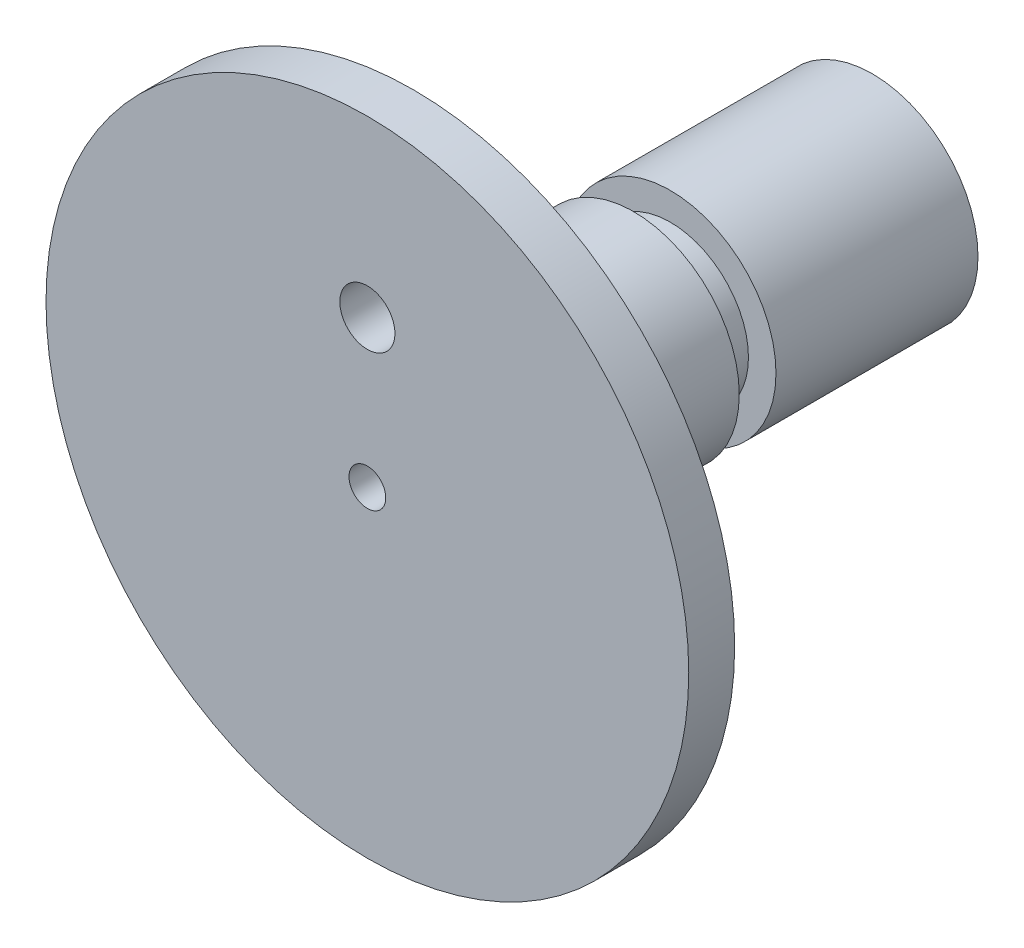
ISO-10303-21;
HEADER;
FILE_DESCRIPTION(('STEP AP214'),'2;1');
FILE_NAME('part.step','',(''),(''),'','','');
FILE_SCHEMA(('AUTOMOTIVE_DESIGN { 1 0 10303 214 1 1 1 1 }'));
ENDSEC;
DATA;
#1=APPLICATION_CONTEXT('core data for automotive mechanical design processes');
#2=APPLICATION_PROTOCOL_DEFINITION('international standard','automotive_design',2000,#1);
#3=PRODUCT_CONTEXT('',#1,'mechanical');
#4=PRODUCT('Part','Part','',(#3));
#5=PRODUCT_RELATED_PRODUCT_CATEGORY('part','',(#4));
#6=PRODUCT_DEFINITION_FORMATION('','',#4);
#7=PRODUCT_DEFINITION_CONTEXT('part definition',#1,'design');
#8=PRODUCT_DEFINITION('design','',#6,#7);
#9=PRODUCT_DEFINITION_SHAPE('','',#8);
#10=(LENGTH_UNIT() NAMED_UNIT(*) SI_UNIT(.MILLI.,.METRE.));
#11=(NAMED_UNIT(*) PLANE_ANGLE_UNIT() SI_UNIT($,.RADIAN.));
#12=(NAMED_UNIT(*) SI_UNIT($,.STERADIAN.) SOLID_ANGLE_UNIT());
#13=UNCERTAINTY_MEASURE_WITH_UNIT(LENGTH_MEASURE(1.E-05),#10,'distance_accuracy_value','');
#14=(GEOMETRIC_REPRESENTATION_CONTEXT(3) GLOBAL_UNCERTAINTY_ASSIGNED_CONTEXT((#13)) GLOBAL_UNIT_ASSIGNED_CONTEXT((#10,
#11,#12)) REPRESENTATION_CONTEXT('',''));
#15=CARTESIAN_POINT('',(0.,0.,0.));
#16=DIRECTION('',(0.,0.,1.));
#17=DIRECTION('',(1.,0.,0.));
#18=AXIS2_PLACEMENT_3D('',#15,#16,#17);
#19=CARTESIAN_POINT('',(0.,0.,-26.25));
#20=DIRECTION('',(0.,0.,1.));
#21=DIRECTION('',(1.,0.,0.));
#22=AXIS2_PLACEMENT_3D('',#19,#20,#21);
#23=CYLINDRICAL_SURFACE('',#22,5.75);
#24=CARTESIAN_POINT('',(0.,0.,-7.25));
#25=DIRECTION('',(0.,0.,1.));
#26=DIRECTION('',(1.,0.,0.));
#27=AXIS2_PLACEMENT_3D('',#24,#25,#26);
#28=CIRCLE('',#27,5.75);
#29=CARTESIAN_POINT('',(5.75,0.,-7.25));
#30=VERTEX_POINT('',#29);
#31=EDGE_CURVE('E161',#30,#30,#28,.T.);
#32=ORIENTED_EDGE('',*,*,#31,.T.);
#33=EDGE_LOOP('',(#32));
#34=FACE_BOUND('',#33,.T.);
#35=CARTESIAN_POINT('',(0.,0.,-1.25));
#36=DIRECTION('',(0.,0.,-1.));
#37=DIRECTION('',(-1.,0.,0.));
#38=AXIS2_PLACEMENT_3D('',#35,#36,#37);
#39=CIRCLE('',#38,5.75);
#40=CARTESIAN_POINT('',(-5.75,0.,-1.25));
#41=VERTEX_POINT('',#40);
#42=EDGE_CURVE('E11',#41,#41,#39,.T.);
#43=ORIENTED_EDGE('',*,*,#42,.T.);
#44=EDGE_LOOP('',(#43));
#45=FACE_BOUND('',#44,.T.);
#46=ADVANCED_FACE('F40',(#34,#45),#23,.T.);
#47=CARTESIAN_POINT('',(0.,0.,1.25));
#48=DIRECTION('',(0.,0.,-1.));
#49=DIRECTION('',(-1.,0.,0.));
#50=AXIS2_PLACEMENT_3D('',#47,#48,#49);
#51=CYLINDRICAL_SURFACE('',#50,17.5);
#52=CARTESIAN_POINT('',(0.,0.,1.25));
#53=DIRECTION('',(0.,0.,1.));
#54=DIRECTION('',(1.,0.,0.));
#55=AXIS2_PLACEMENT_3D('',#52,#53,#54);
#56=CIRCLE('',#55,17.5);
#57=CARTESIAN_POINT('',(17.5,0.,1.25));
#58=VERTEX_POINT('',#57);
#59=EDGE_CURVE('E50',#58,#58,#56,.T.);
#60=ORIENTED_EDGE('',*,*,#59,.F.);
#61=EDGE_LOOP('',(#60));
#62=FACE_BOUND('',#61,.T.);
#63=CARTESIAN_POINT('',(0.,0.,-1.25));
#64=DIRECTION('',(0.,0.,1.));
#65=DIRECTION('',(1.,0.,0.));
#66=AXIS2_PLACEMENT_3D('',#63,#64,#65);
#67=CIRCLE('',#66,17.5);
#68=CARTESIAN_POINT('',(17.5,0.,-1.25));
#69=VERTEX_POINT('',#68);
#70=EDGE_CURVE('E92',#69,#69,#67,.T.);
#71=ORIENTED_EDGE('',*,*,#70,.T.);
#72=EDGE_LOOP('',(#71));
#73=FACE_BOUND('',#72,.T.);
#74=ADVANCED_FACE('F42',(#62,#73),#51,.T.);
#75=CARTESIAN_POINT('',(0.,0.,1.25));
#76=DIRECTION('',(0.,0.,1.));
#77=DIRECTION('',(1.,0.,0.));
#78=AXIS2_PLACEMENT_3D('',#75,#76,#77);
#79=PLANE('',#78);
#80=CARTESIAN_POINT('',(0.,8.,1.25));
#81=DIRECTION('',(0.,0.,1.));
#82=DIRECTION('',(1.,0.,0.));
#83=AXIS2_PLACEMENT_3D('',#80,#81,#82);
#84=CIRCLE('',#83,1.5);
#85=CARTESIAN_POINT('',(1.5,8.,1.25));
#86=VERTEX_POINT('',#85);
#87=EDGE_CURVE('E155',#86,#86,#84,.T.);
#88=ORIENTED_EDGE('',*,*,#87,.F.);
#89=EDGE_LOOP('',(#88));
#90=FACE_BOUND('',#89,.T.);
#91=CARTESIAN_POINT('',(0.,0.,1.25));
#92=DIRECTION('',(0.,0.,1.));
#93=DIRECTION('',(1.,0.,0.));
#94=AXIS2_PLACEMENT_3D('',#91,#92,#93);
#95=CIRCLE('',#94,1.);
#96=CARTESIAN_POINT('',(1.,0.,1.25));
#97=VERTEX_POINT('',#96);
#98=EDGE_CURVE('E146',#97,#97,#95,.T.);
#99=ORIENTED_EDGE('',*,*,#98,.F.);
#100=EDGE_LOOP('',(#99));
#101=FACE_BOUND('',#100,.T.);
#102=ORIENTED_EDGE('',*,*,#59,.T.);
#103=EDGE_LOOP('',(#102));
#104=FACE_BOUND('',#103,.T.);
#105=ADVANCED_FACE('F218',(#90,#101,#104),#79,.T.);
#106=CARTESIAN_POINT('',(0.,0.,-1.25));
#107=DIRECTION('',(0.,0.,1.));
#108=DIRECTION('',(1.,0.,0.));
#109=AXIS2_PLACEMENT_3D('',#106,#107,#108);
#110=PLANE('',#109);
#111=CARTESIAN_POINT('',(0.,8.,-1.25));
#112=DIRECTION('',(0.,0.,1.));
#113=DIRECTION('',(1.,0.,0.));
#114=AXIS2_PLACEMENT_3D('',#111,#112,#113);
#115=CIRCLE('',#114,1.5);
#116=CARTESIAN_POINT('',(1.5,8.,-1.25));
#117=VERTEX_POINT('',#116);
#118=EDGE_CURVE('E44',#117,#117,#115,.T.);
#119=ORIENTED_EDGE('',*,*,#118,.T.);
#120=EDGE_LOOP('',(#119));
#121=FACE_BOUND('',#120,.T.);
#122=ORIENTED_EDGE('',*,*,#42,.F.);
#123=EDGE_LOOP('',(#122));
#124=FACE_BOUND('',#123,.T.);
#125=ORIENTED_EDGE('',*,*,#70,.F.);
#126=EDGE_LOOP('',(#125));
#127=FACE_BOUND('',#126,.T.);
#128=ADVANCED_FACE('F210',(#121,#124,#127),#110,.F.);
#129=CARTESIAN_POINT('',(0.,0.,-26.25));
#130=DIRECTION('',(0.,0.,1.));
#131=DIRECTION('',(1.,0.,0.));
#132=AXIS2_PLACEMENT_3D('',#129,#130,#131);
#133=CYLINDRICAL_SURFACE('',#132,2.75);
#134=CARTESIAN_POINT('',(0.,0.,-1.25));
#135=DIRECTION('',(0.,0.,-1.));
#136=DIRECTION('',(-1.,0.,0.));
#137=AXIS2_PLACEMENT_3D('',#134,#135,#136);
#138=CIRCLE('',#137,2.75);
#139=CARTESIAN_POINT('',(-1.95,1.93907194296653,-1.25));
#140=VERTEX_POINT('',#139);
#141=CARTESIAN_POINT('',(1.95,1.93907194296653,-1.25));
#142=VERTEX_POINT('',#141);
#143=EDGE_CURVE('E58',#140,#142,#138,.T.);
#144=ORIENTED_EDGE('',*,*,#143,.F.);
#145=DIRECTION('',(0.,0.,1.));
#146=VECTOR('',#145,1.);
#147=CARTESIAN_POINT('',(-1.95,1.93907194296653,-26.25));
#148=LINE('',#147,#146);
#149=CARTESIAN_POINT('',(-1.95,1.93907194296653,-26.25));
#150=VERTEX_POINT('',#149);
#151=EDGE_CURVE('E83',#150,#140,#148,.T.);
#152=ORIENTED_EDGE('',*,*,#151,.F.);
#153=CARTESIAN_POINT('',(0.,0.,-26.25));
#154=DIRECTION('',(0.,0.,-1.));
#155=DIRECTION('',(-1.,0.,0.));
#156=AXIS2_PLACEMENT_3D('',#153,#154,#155);
#157=CIRCLE('',#156,2.75);
#158=CARTESIAN_POINT('',(1.95,1.93907194296653,-26.25));
#159=VERTEX_POINT('',#158);
#160=EDGE_CURVE('E87',#150,#159,#157,.T.);
#161=ORIENTED_EDGE('',*,*,#160,.T.);
#162=DIRECTION('',(0.,0.,1.));
#163=VECTOR('',#162,1.);
#164=CARTESIAN_POINT('',(1.95,1.93907194296653,-26.25));
#165=LINE('',#164,#163);
#166=EDGE_CURVE('E123',#159,#142,#165,.T.);
#167=ORIENTED_EDGE('',*,*,#166,.T.);
#168=EDGE_LOOP('',(#144,#152,#161,#167));
#169=FACE_BOUND('',#168,.T.);
#170=ADVANCED_FACE('F85',(#169),#133,.F.);
#171=CARTESIAN_POINT('',(-1.95,0.,-26.25));
#172=DIRECTION('',(-1.,0.,0.));
#173=DIRECTION('',(0.,-1.,0.));
#174=AXIS2_PLACEMENT_3D('',#171,#172,#173);
#175=PLANE('',#174);
#176=DIRECTION('',(0.,-1.,0.));
#177=VECTOR('',#176,1.);
#178=CARTESIAN_POINT('',(-1.95,0.,-1.25));
#179=LINE('',#178,#177);
#180=CARTESIAN_POINT('',(-1.95,-1.93907194296653,-1.25));
#181=VERTEX_POINT('',#180);
#182=EDGE_CURVE('E128',#140,#181,#179,.T.);
#183=ORIENTED_EDGE('',*,*,#182,.T.);
#184=DIRECTION('',(0.,0.,1.));
#185=VECTOR('',#184,1.);
#186=CARTESIAN_POINT('',(-1.95,-1.93907194296653,-26.25));
#187=LINE('',#186,#185);
#188=CARTESIAN_POINT('',(-1.95,-1.93907194296653,-26.25));
#189=VERTEX_POINT('',#188);
#190=EDGE_CURVE('E93',#189,#181,#187,.T.);
#191=ORIENTED_EDGE('',*,*,#190,.F.);
#192=DIRECTION('',(0.,-1.,0.));
#193=VECTOR('',#192,1.);
#194=CARTESIAN_POINT('',(-1.95,0.,-26.25));
#195=LINE('',#194,#193);
#196=EDGE_CURVE('E96',#150,#189,#195,.T.);
#197=ORIENTED_EDGE('',*,*,#196,.F.);
#198=ORIENTED_EDGE('',*,*,#151,.T.);
#199=EDGE_LOOP('',(#183,#191,#197,#198));
#200=FACE_BOUND('',#199,.T.);
#201=ADVANCED_FACE('F97',(#200),#175,.F.);
#202=CARTESIAN_POINT('',(1.95,-1.93907194296653,-1.25));
#203=VERTEX_POINT('',#202);
#204=EDGE_CURVE('E112',#203,#181,#138,.T.);
#205=ORIENTED_EDGE('',*,*,#204,.F.);
#206=DIRECTION('',(0.,0.,1.));
#207=VECTOR('',#206,1.);
#208=CARTESIAN_POINT('',(1.95,-1.93907194296653,-26.25));
#209=LINE('',#208,#207);
#210=CARTESIAN_POINT('',(1.95,-1.93907194296653,-26.25));
#211=VERTEX_POINT('',#210);
#212=EDGE_CURVE('E134',#211,#203,#209,.T.);
#213=ORIENTED_EDGE('',*,*,#212,.F.);
#214=EDGE_CURVE('E103',#211,#189,#157,.T.);
#215=ORIENTED_EDGE('',*,*,#214,.T.);
#216=ORIENTED_EDGE('',*,*,#190,.T.);
#217=EDGE_LOOP('',(#205,#213,#215,#216));
#218=FACE_BOUND('',#217,.T.);
#219=ADVANCED_FACE('F330',(#218),#133,.F.);
#220=CARTESIAN_POINT('',(1.95,0.,-26.25));
#221=DIRECTION('',(-1.,0.,0.));
#222=DIRECTION('',(0.,0.,1.));
#223=AXIS2_PLACEMENT_3D('',#220,#221,#222);
#224=PLANE('',#223);
#225=DIRECTION('',(0.,-1.,0.));
#226=VECTOR('',#225,1.);
#227=CARTESIAN_POINT('',(1.95,0.,-1.25));
#228=LINE('',#227,#226);
#229=EDGE_CURVE('E63',#142,#203,#228,.T.);
#230=ORIENTED_EDGE('',*,*,#229,.F.);
#231=ORIENTED_EDGE('',*,*,#166,.F.);
#232=DIRECTION('',(0.,-1.,0.));
#233=VECTOR('',#232,1.);
#234=CARTESIAN_POINT('',(1.95,0.,-26.25));
#235=LINE('',#234,#233);
#236=EDGE_CURVE('E108',#159,#211,#235,.T.);
#237=ORIENTED_EDGE('',*,*,#236,.T.);
#238=ORIENTED_EDGE('',*,*,#212,.T.);
#239=EDGE_LOOP('',(#230,#231,#237,#238));
#240=FACE_BOUND('',#239,.T.);
#241=ADVANCED_FACE('F198',(#240),#224,.T.);
#242=CARTESIAN_POINT('',(0.,0.,-15.25));
#243=DIRECTION('',(0.,0.,1.));
#244=DIRECTION('',(1.,0.,0.));
#245=AXIS2_PLACEMENT_3D('',#242,#243,#244);
#246=CIRCLE('',#245,5.75);
#247=CARTESIAN_POINT('',(5.75,0.,-15.25));
#248=VERTEX_POINT('',#247);
#249=EDGE_CURVE('E165',#248,#248,#246,.T.);
#250=ORIENTED_EDGE('',*,*,#249,.F.);
#251=EDGE_LOOP('',(#250));
#252=FACE_BOUND('',#251,.T.);
#253=CARTESIAN_POINT('',(0.,0.,-26.25));
#254=DIRECTION('',(0.,0.,-1.));
#255=DIRECTION('',(-1.,0.,0.));
#256=AXIS2_PLACEMENT_3D('',#253,#254,#255);
#257=CIRCLE('',#256,5.75);
#258=CARTESIAN_POINT('',(-5.75,0.,-26.25));
#259=VERTEX_POINT('',#258);
#260=EDGE_CURVE('E118',#259,#259,#257,.T.);
#261=ORIENTED_EDGE('',*,*,#260,.F.);
#262=EDGE_LOOP('',(#261));
#263=FACE_BOUND('',#262,.T.);
#264=ADVANCED_FACE('F195',(#252,#263),#23,.T.);
#265=CARTESIAN_POINT('',(0.,0.,-26.25));
#266=DIRECTION('',(0.,0.,-1.));
#267=DIRECTION('',(-1.,0.,0.));
#268=AXIS2_PLACEMENT_3D('',#265,#266,#267);
#269=PLANE('',#268);
#270=ORIENTED_EDGE('',*,*,#160,.F.);
#271=ORIENTED_EDGE('',*,*,#196,.T.);
#272=ORIENTED_EDGE('',*,*,#214,.F.);
#273=ORIENTED_EDGE('',*,*,#236,.F.);
#274=EDGE_LOOP('',(#270,#271,#272,#273));
#275=FACE_BOUND('',#274,.T.);
#276=ORIENTED_EDGE('',*,*,#260,.T.);
#277=EDGE_LOOP('',(#276));
#278=FACE_BOUND('',#277,.T.);
#279=ADVANCED_FACE('F105',(#275,#278),#269,.T.);
#280=CARTESIAN_POINT('',(0.,0.,-1.25));
#281=DIRECTION('',(0.,0.,1.));
#282=DIRECTION('',(1.,0.,0.));
#283=AXIS2_PLACEMENT_3D('',#280,#281,#282);
#284=CIRCLE('',#283,1.);
#285=CARTESIAN_POINT('',(1.,0.,-1.25));
#286=VERTEX_POINT('',#285);
#287=EDGE_CURVE('E129',#286,#286,#284,.T.);
#288=ORIENTED_EDGE('',*,*,#287,.T.);
#289=EDGE_LOOP('',(#288));
#290=FACE_BOUND('',#289,.T.);
#291=ORIENTED_EDGE('',*,*,#182,.F.);
#292=ORIENTED_EDGE('',*,*,#143,.T.);
#293=ORIENTED_EDGE('',*,*,#229,.T.);
#294=ORIENTED_EDGE('',*,*,#204,.T.);
#295=EDGE_LOOP('',(#291,#292,#293,#294));
#296=FACE_BOUND('',#295,.T.);
#297=ADVANCED_FACE('F203',(#290,#296),#110,.F.);
#298=CARTESIAN_POINT('',(0.,0.,-13.75));
#299=DIRECTION('',(0.,0.,1.));
#300=DIRECTION('',(1.,0.,0.));
#301=AXIS2_PLACEMENT_3D('',#298,#299,#300);
#302=CYLINDRICAL_SURFACE('',#301,1.);
#303=ORIENTED_EDGE('',*,*,#98,.T.);
#304=EDGE_LOOP('',(#303));
#305=FACE_BOUND('',#304,.T.);
#306=ORIENTED_EDGE('',*,*,#287,.F.);
#307=EDGE_LOOP('',(#306));
#308=FACE_BOUND('',#307,.T.);
#309=ADVANCED_FACE('F209',(#305,#308),#302,.F.);
#310=CARTESIAN_POINT('',(0.,8.,-8.75));
#311=DIRECTION('',(0.,0.,1.));
#312=DIRECTION('',(1.,0.,0.));
#313=AXIS2_PLACEMENT_3D('',#310,#311,#312);
#314=CYLINDRICAL_SURFACE('',#313,1.5);
#315=ORIENTED_EDGE('',*,*,#87,.T.);
#316=EDGE_LOOP('',(#315));
#317=FACE_BOUND('',#316,.T.);
#318=ORIENTED_EDGE('',*,*,#118,.F.);
#319=EDGE_LOOP('',(#318));
#320=FACE_BOUND('',#319,.T.);
#321=ADVANCED_FACE('F255',(#317,#320),#314,.F.);
#322=CARTESIAN_POINT('',(5.75,0.,-7.25));
#323=DIRECTION('',(0.,0.,1.));
#324=DIRECTION('',(1.,0.,0.));
#325=AXIS2_PLACEMENT_3D('',#322,#323,#324);
#326=PLANE('',#325);
#327=ORIENTED_EDGE('',*,*,#31,.F.);
#328=EDGE_LOOP('',(#327));
#329=FACE_BOUND('',#328,.T.);
#330=CARTESIAN_POINT('',(0.,0.,-7.25));
#331=DIRECTION('',(0.,0.,1.));
#332=DIRECTION('',(1.,0.,0.));
#333=AXIS2_PLACEMENT_3D('',#330,#331,#332);
#334=CIRCLE('',#333,4.75);
#335=CARTESIAN_POINT('',(4.75,0.,-7.25));
#336=VERTEX_POINT('',#335);
#337=EDGE_CURVE('E166',#336,#336,#334,.T.);
#338=ORIENTED_EDGE('',*,*,#337,.T.);
#339=EDGE_LOOP('',(#338));
#340=FACE_BOUND('',#339,.T.);
#341=ADVANCED_FACE('F247',(#329,#340),#326,.F.);
#342=CARTESIAN_POINT('',(0.,0.,0.));
#343=DIRECTION('',(0.,0.,1.));
#344=DIRECTION('',(1.,0.,0.));
#345=AXIS2_PLACEMENT_3D('',#342,#343,#344);
#346=CYLINDRICAL_SURFACE('',#345,4.75);
#347=ORIENTED_EDGE('',*,*,#337,.F.);
#348=EDGE_LOOP('',(#347));
#349=FACE_BOUND('',#348,.T.);
#350=CARTESIAN_POINT('',(0.,0.,-9.25));
#351=DIRECTION('',(0.,0.,1.));
#352=DIRECTION('',(1.,0.,0.));
#353=AXIS2_PLACEMENT_3D('',#350,#351,#352);
#354=CIRCLE('',#353,4.75);
#355=CARTESIAN_POINT('',(4.75,0.,-9.25));
#356=VERTEX_POINT('',#355);
#357=EDGE_CURVE('E170',#356,#356,#354,.T.);
#358=ORIENTED_EDGE('',*,*,#357,.T.);
#359=EDGE_LOOP('',(#358));
#360=FACE_BOUND('',#359,.T.);
#361=ADVANCED_FACE('F238',(#349,#360),#346,.T.);
#362=CARTESIAN_POINT('',(5.75,0.,-9.25));
#363=DIRECTION('',(0.,0.,-1.));
#364=DIRECTION('',(-1.,0.,0.));
#365=AXIS2_PLACEMENT_3D('',#362,#363,#364);
#366=PLANE('',#365);
#367=ORIENTED_EDGE('',*,*,#357,.F.);
#368=EDGE_LOOP('',(#367));
#369=FACE_BOUND('',#368,.T.);
#370=CARTESIAN_POINT('',(0.,0.,-9.25));
#371=DIRECTION('',(0.,0.,1.));
#372=DIRECTION('',(1.,0.,0.));
#373=AXIS2_PLACEMENT_3D('',#370,#371,#372);
#374=CIRCLE('',#373,5.75);
#375=CARTESIAN_POINT('',(5.75,0.,-9.25));
#376=VERTEX_POINT('',#375);
#377=EDGE_CURVE('E174',#376,#376,#374,.T.);
#378=ORIENTED_EDGE('',*,*,#377,.T.);
#379=EDGE_LOOP('',(#378));
#380=FACE_BOUND('',#379,.T.);
#381=ADVANCED_FACE('F235',(#369,#380),#366,.F.);
#382=CARTESIAN_POINT('',(5.75,0.,-13.25));
#383=DIRECTION('',(0.,0.,1.));
#384=DIRECTION('',(1.,0.,0.));
#385=AXIS2_PLACEMENT_3D('',#382,#383,#384);
#386=PLANE('',#385);
#387=CARTESIAN_POINT('',(0.,0.,-13.25));
#388=DIRECTION('',(0.,0.,1.));
#389=DIRECTION('',(1.,0.,0.));
#390=AXIS2_PLACEMENT_3D('',#387,#388,#389);
#391=CIRCLE('',#390,5.75);
#392=CARTESIAN_POINT('',(5.75,0.,-13.25));
#393=VERTEX_POINT('',#392);
#394=EDGE_CURVE('E160',#393,#393,#391,.T.);
#395=ORIENTED_EDGE('',*,*,#394,.F.);
#396=EDGE_LOOP('',(#395));
#397=FACE_BOUND('',#396,.T.);
#398=CARTESIAN_POINT('',(0.,0.,-13.25));
#399=DIRECTION('',(0.,0.,1.));
#400=DIRECTION('',(1.,0.,0.));
#401=AXIS2_PLACEMENT_3D('',#398,#399,#400);
#402=CIRCLE('',#401,4.25);
#403=CARTESIAN_POINT('',(4.25,0.,-13.25));
#404=VERTEX_POINT('',#403);
#405=EDGE_CURVE('E181',#404,#404,#402,.T.);
#406=ORIENTED_EDGE('',*,*,#405,.T.);
#407=EDGE_LOOP('',(#406));
#408=FACE_BOUND('',#407,.T.);
#409=ADVANCED_FACE('F237',(#397,#408),#386,.F.);
#410=CARTESIAN_POINT('',(0.,0.,0.));
#411=DIRECTION('',(0.,0.,1.));
#412=DIRECTION('',(1.,0.,0.));
#413=AXIS2_PLACEMENT_3D('',#410,#411,#412);
#414=CYLINDRICAL_SURFACE('',#413,4.25);
#415=ORIENTED_EDGE('',*,*,#405,.F.);
#416=EDGE_LOOP('',(#415));
#417=FACE_BOUND('',#416,.T.);
#418=CARTESIAN_POINT('',(0.,0.,-15.25));
#419=DIRECTION('',(0.,0.,1.));
#420=DIRECTION('',(1.,0.,0.));
#421=AXIS2_PLACEMENT_3D('',#418,#419,#420);
#422=CIRCLE('',#421,4.25);
#423=CARTESIAN_POINT('',(4.25,0.,-15.25));
#424=VERTEX_POINT('',#423);
#425=EDGE_CURVE('E185',#424,#424,#422,.T.);
#426=ORIENTED_EDGE('',*,*,#425,.T.);
#427=EDGE_LOOP('',(#426));
#428=FACE_BOUND('',#427,.T.);
#429=ADVANCED_FACE('F228',(#417,#428),#414,.T.);
#430=CARTESIAN_POINT('',(5.75,0.,-15.25));
#431=DIRECTION('',(0.,0.,-1.));
#432=DIRECTION('',(-1.,0.,0.));
#433=AXIS2_PLACEMENT_3D('',#430,#431,#432);
#434=PLANE('',#433);
#435=ORIENTED_EDGE('',*,*,#425,.F.);
#436=EDGE_LOOP('',(#435));
#437=FACE_BOUND('',#436,.T.);
#438=ORIENTED_EDGE('',*,*,#249,.T.);
#439=EDGE_LOOP('',(#438));
#440=FACE_BOUND('',#439,.T.);
#441=ADVANCED_FACE('F193',(#437,#440),#434,.F.);
#442=ORIENTED_EDGE('',*,*,#394,.T.);
#443=EDGE_LOOP('',(#442));
#444=FACE_BOUND('',#443,.T.);
#445=ORIENTED_EDGE('',*,*,#377,.F.);
#446=EDGE_LOOP('',(#445));
#447=FACE_BOUND('',#446,.T.);
#448=ADVANCED_FACE('F200',(#444,#447),#23,.T.);
#449=CLOSED_SHELL('',(#46,#74,#105,#128,#170,#201,#219,#241,#264,#279,#297,#309,#321,#341,#361,
#381,#409,#429,#441,#448));
#450=MANIFOLD_SOLID_BREP('B2',#449);
#451=ADVANCED_BREP_SHAPE_REPRESENTATION('',(#18,#450),#14);
#452=SHAPE_DEFINITION_REPRESENTATION(#9,#451);
ENDSEC;
END-ISO-10303-21;
